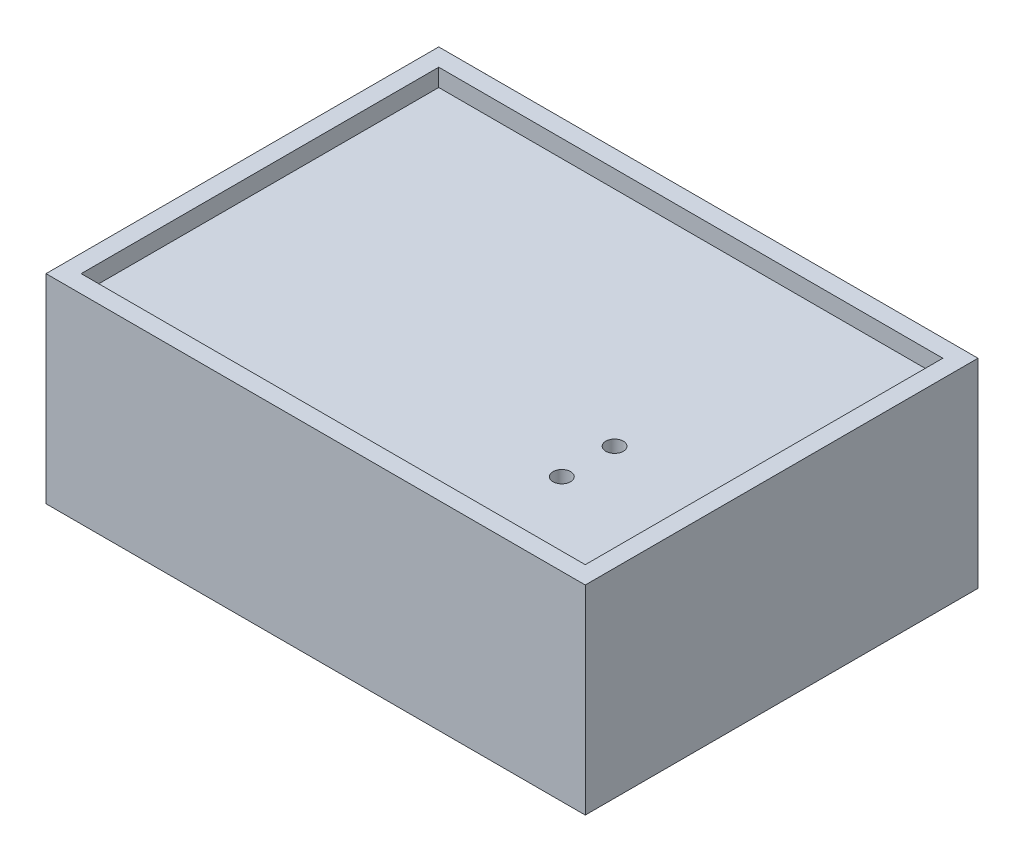
ISO-10303-21;
HEADER;
FILE_DESCRIPTION(('STEP AP214'),'2;1');
FILE_NAME('part.step','',(''),(''),'','','');
FILE_SCHEMA(('AUTOMOTIVE_DESIGN { 1 0 10303 214 1 1 1 1 }'));
ENDSEC;
DATA;
#1=APPLICATION_CONTEXT('core data for automotive mechanical design processes');
#2=APPLICATION_PROTOCOL_DEFINITION('international standard','automotive_design',2000,#1);
#3=PRODUCT_CONTEXT('',#1,'mechanical');
#4=PRODUCT('Part','Part','',(#3));
#5=PRODUCT_RELATED_PRODUCT_CATEGORY('part','',(#4));
#6=PRODUCT_DEFINITION_FORMATION('','',#4);
#7=PRODUCT_DEFINITION_CONTEXT('part definition',#1,'design');
#8=PRODUCT_DEFINITION('design','',#6,#7);
#9=PRODUCT_DEFINITION_SHAPE('','',#8);
#10=(LENGTH_UNIT() NAMED_UNIT(*) SI_UNIT(.MILLI.,.METRE.));
#11=(NAMED_UNIT(*) PLANE_ANGLE_UNIT() SI_UNIT($,.RADIAN.));
#12=(NAMED_UNIT(*) SI_UNIT($,.STERADIAN.) SOLID_ANGLE_UNIT());
#13=UNCERTAINTY_MEASURE_WITH_UNIT(LENGTH_MEASURE(1.E-05),#10,'distance_accuracy_value','');
#14=(GEOMETRIC_REPRESENTATION_CONTEXT(3) GLOBAL_UNCERTAINTY_ASSIGNED_CONTEXT((#13)) GLOBAL_UNIT_ASSIGNED_CONTEXT((#10,
#11,#12)) REPRESENTATION_CONTEXT('',''));
#15=CARTESIAN_POINT('',(0.,0.,0.));
#16=DIRECTION('',(0.,0.,1.));
#17=DIRECTION('',(1.,0.,0.));
#18=AXIS2_PLACEMENT_3D('',#15,#16,#17);
#19=CARTESIAN_POINT('',(46.,34.,33.5));
#20=DIRECTION('',(-1.,0.,0.));
#21=DIRECTION('',(0.,0.,1.));
#22=AXIS2_PLACEMENT_3D('',#19,#20,#21);
#23=PLANE('',#22);
#24=DIRECTION('',(0.,0.,-1.));
#25=VECTOR('',#24,1.);
#26=CARTESIAN_POINT('',(46.,0.,33.5));
#27=LINE('',#26,#25);
#28=CARTESIAN_POINT('',(46.,0.,33.5));
#29=VERTEX_POINT('',#28);
#30=CARTESIAN_POINT('',(46.,0.,-33.5));
#31=VERTEX_POINT('',#30);
#32=EDGE_CURVE('E207',#29,#31,#27,.T.);
#33=ORIENTED_EDGE('',*,*,#32,.T.);
#34=DIRECTION('',(0.,-1.,0.));
#35=VECTOR('',#34,1.);
#36=CARTESIAN_POINT('',(46.,34.,-33.5));
#37=LINE('',#36,#35);
#38=CARTESIAN_POINT('',(46.,34.,-33.5));
#39=VERTEX_POINT('',#38);
#40=EDGE_CURVE('E11',#39,#31,#37,.T.);
#41=ORIENTED_EDGE('',*,*,#40,.F.);
#42=DIRECTION('',(0.,0.,-1.));
#43=VECTOR('',#42,1.);
#44=CARTESIAN_POINT('',(46.,34.,33.5));
#45=LINE('',#44,#43);
#46=CARTESIAN_POINT('',(46.,34.,33.5));
#47=VERTEX_POINT('',#46);
#48=EDGE_CURVE('E213',#47,#39,#45,.T.);
#49=ORIENTED_EDGE('',*,*,#48,.F.);
#50=DIRECTION('',(0.,-1.,0.));
#51=VECTOR('',#50,1.);
#52=CARTESIAN_POINT('',(46.,34.,33.5));
#53=LINE('',#52,#51);
#54=EDGE_CURVE('E223',#47,#29,#53,.T.);
#55=ORIENTED_EDGE('',*,*,#54,.T.);
#56=EDGE_LOOP('',(#33,#41,#49,#55));
#57=FACE_BOUND('',#56,.T.);
#58=ADVANCED_FACE('F40',(#57),#23,.F.);
#59=CARTESIAN_POINT('',(-46.,34.,-33.5));
#60=DIRECTION('',(0.,0.,1.));
#61=DIRECTION('',(1.,0.,0.));
#62=AXIS2_PLACEMENT_3D('',#59,#60,#61);
#63=PLANE('',#62);
#64=DIRECTION('',(-1.,0.,0.));
#65=VECTOR('',#64,1.);
#66=CARTESIAN_POINT('',(-46.,0.,-33.5));
#67=LINE('',#66,#65);
#68=CARTESIAN_POINT('',(-46.,0.,-33.5));
#69=VERTEX_POINT('',#68);
#70=EDGE_CURVE('E226',#31,#69,#67,.T.);
#71=ORIENTED_EDGE('',*,*,#70,.T.);
#72=DIRECTION('',(0.,-1.,0.));
#73=VECTOR('',#72,1.);
#74=CARTESIAN_POINT('',(-46.,34.,-33.5));
#75=LINE('',#74,#73);
#76=CARTESIAN_POINT('',(-46.,34.,-33.5));
#77=VERTEX_POINT('',#76);
#78=EDGE_CURVE('E47',#77,#69,#75,.T.);
#79=ORIENTED_EDGE('',*,*,#78,.F.);
#80=DIRECTION('',(-1.,0.,0.));
#81=VECTOR('',#80,1.);
#82=CARTESIAN_POINT('',(-46.,34.,-33.5));
#83=LINE('',#82,#81);
#84=EDGE_CURVE('E216',#39,#77,#83,.T.);
#85=ORIENTED_EDGE('',*,*,#84,.F.);
#86=ORIENTED_EDGE('',*,*,#40,.T.);
#87=EDGE_LOOP('',(#71,#79,#85,#86));
#88=FACE_BOUND('',#87,.T.);
#89=ADVANCED_FACE('F256',(#88),#63,.F.);
#90=CARTESIAN_POINT('',(-46.,34.,33.5));
#91=DIRECTION('',(1.,0.,0.));
#92=DIRECTION('',(0.,0.,-1.));
#93=AXIS2_PLACEMENT_3D('',#90,#91,#92);
#94=PLANE('',#93);
#95=DIRECTION('',(0.,0.,1.));
#96=VECTOR('',#95,1.);
#97=CARTESIAN_POINT('',(-46.,0.,33.5));
#98=LINE('',#97,#96);
#99=CARTESIAN_POINT('',(-46.,0.,33.5));
#100=VERTEX_POINT('',#99);
#101=EDGE_CURVE('E228',#69,#100,#98,.T.);
#102=ORIENTED_EDGE('',*,*,#101,.T.);
#103=DIRECTION('',(0.,-1.,0.));
#104=VECTOR('',#103,1.);
#105=CARTESIAN_POINT('',(-46.,34.,33.5));
#106=LINE('',#105,#104);
#107=CARTESIAN_POINT('',(-46.,34.,33.5));
#108=VERTEX_POINT('',#107);
#109=EDGE_CURVE('E233',#108,#100,#106,.T.);
#110=ORIENTED_EDGE('',*,*,#109,.F.);
#111=DIRECTION('',(0.,0.,1.));
#112=VECTOR('',#111,1.);
#113=CARTESIAN_POINT('',(-46.,34.,33.5));
#114=LINE('',#113,#112);
#115=EDGE_CURVE('E219',#77,#108,#114,.T.);
#116=ORIENTED_EDGE('',*,*,#115,.F.);
#117=ORIENTED_EDGE('',*,*,#78,.T.);
#118=EDGE_LOOP('',(#102,#110,#116,#117));
#119=FACE_BOUND('',#118,.T.);
#120=ADVANCED_FACE('F240',(#119),#94,.F.);
#121=CARTESIAN_POINT('',(-46.,34.,33.5));
#122=DIRECTION('',(0.,0.,-1.));
#123=DIRECTION('',(-1.,0.,0.));
#124=AXIS2_PLACEMENT_3D('',#121,#122,#123);
#125=PLANE('',#124);
#126=DIRECTION('',(1.,0.,0.));
#127=VECTOR('',#126,1.);
#128=CARTESIAN_POINT('',(-46.,0.,33.5));
#129=LINE('',#128,#127);
#130=EDGE_CURVE('E217',#100,#29,#129,.T.);
#131=ORIENTED_EDGE('',*,*,#130,.T.);
#132=ORIENTED_EDGE('',*,*,#54,.F.);
#133=DIRECTION('',(1.,0.,0.));
#134=VECTOR('',#133,1.);
#135=CARTESIAN_POINT('',(-46.,34.,33.5));
#136=LINE('',#135,#134);
#137=EDGE_CURVE('E221',#108,#47,#136,.T.);
#138=ORIENTED_EDGE('',*,*,#137,.F.);
#139=ORIENTED_EDGE('',*,*,#109,.T.);
#140=EDGE_LOOP('',(#131,#132,#138,#139));
#141=FACE_BOUND('',#140,.T.);
#142=ADVANCED_FACE('F249',(#141),#125,.F.);
#143=CARTESIAN_POINT('',(0.,34.,0.));
#144=DIRECTION('',(0.,-1.,0.));
#145=DIRECTION('',(0.,0.,-1.));
#146=AXIS2_PLACEMENT_3D('',#143,#144,#145);
#147=PLANE('',#146);
#148=DIRECTION('',(0.,0.,-1.));
#149=VECTOR('',#148,1.);
#150=CARTESIAN_POINT('',(43.,34.,30.5));
#151=LINE('',#150,#149);
#152=CARTESIAN_POINT('',(43.,34.,30.5));
#153=VERTEX_POINT('',#152);
#154=CARTESIAN_POINT('',(43.,34.,-30.5));
#155=VERTEX_POINT('',#154);
#156=EDGE_CURVE('E197',#153,#155,#151,.T.);
#157=ORIENTED_EDGE('',*,*,#156,.F.);
#158=DIRECTION('',(1.,0.,0.));
#159=VECTOR('',#158,1.);
#160=CARTESIAN_POINT('',(-43.,34.,30.5));
#161=LINE('',#160,#159);
#162=CARTESIAN_POINT('',(-43.,34.,30.5));
#163=VERTEX_POINT('',#162);
#164=EDGE_CURVE('E62',#163,#153,#161,.T.);
#165=ORIENTED_EDGE('',*,*,#164,.F.);
#166=DIRECTION('',(0.,0.,1.));
#167=VECTOR('',#166,1.);
#168=CARTESIAN_POINT('',(-43.,34.,-30.5));
#169=LINE('',#168,#167);
#170=CARTESIAN_POINT('',(-43.,34.,-30.5));
#171=VERTEX_POINT('',#170);
#172=EDGE_CURVE('E186',#171,#163,#169,.T.);
#173=ORIENTED_EDGE('',*,*,#172,.F.);
#174=DIRECTION('',(-1.,0.,0.));
#175=VECTOR('',#174,1.);
#176=CARTESIAN_POINT('',(43.,34.,-30.5));
#177=LINE('',#176,#175);
#178=EDGE_CURVE('E200',#155,#171,#177,.T.);
#179=ORIENTED_EDGE('',*,*,#178,.F.);
#180=EDGE_LOOP('',(#157,#165,#173,#179));
#181=FACE_BOUND('',#180,.T.);
#182=ORIENTED_EDGE('',*,*,#48,.T.);
#183=ORIENTED_EDGE('',*,*,#84,.T.);
#184=ORIENTED_EDGE('',*,*,#115,.T.);
#185=ORIENTED_EDGE('',*,*,#137,.T.);
#186=EDGE_LOOP('',(#182,#183,#184,#185));
#187=FACE_BOUND('',#186,.T.);
#188=ADVANCED_FACE('F255',(#181,#187),#147,.F.);
#189=CARTESIAN_POINT('',(0.,0.,0.));
#190=DIRECTION('',(0.,-1.,0.));
#191=DIRECTION('',(0.,0.,-1.));
#192=AXIS2_PLACEMENT_3D('',#189,#190,#191);
#193=PLANE('',#192);
#194=DIRECTION('',(1.,0.,0.));
#195=VECTOR('',#194,1.);
#196=CARTESIAN_POINT('',(-43.,0.,-30.5));
#197=LINE('',#196,#195);
#198=CARTESIAN_POINT('',(-43.,0.,-30.5));
#199=VERTEX_POINT('',#198);
#200=CARTESIAN_POINT('',(43.,0.,-30.5));
#201=VERTEX_POINT('',#200);
#202=EDGE_CURVE('E54',#199,#201,#197,.T.);
#203=ORIENTED_EDGE('',*,*,#202,.F.);
#204=DIRECTION('',(0.,0.,-1.));
#205=VECTOR('',#204,1.);
#206=CARTESIAN_POINT('',(-43.,0.,30.5));
#207=LINE('',#206,#205);
#208=CARTESIAN_POINT('',(-43.,0.,30.5));
#209=VERTEX_POINT('',#208);
#210=EDGE_CURVE('E148',#209,#199,#207,.T.);
#211=ORIENTED_EDGE('',*,*,#210,.F.);
#212=DIRECTION('',(-1.,0.,0.));
#213=VECTOR('',#212,1.);
#214=CARTESIAN_POINT('',(43.,0.,30.5));
#215=LINE('',#214,#213);
#216=CARTESIAN_POINT('',(43.,0.,30.5));
#217=VERTEX_POINT('',#216);
#218=EDGE_CURVE('E151',#217,#209,#215,.T.);
#219=ORIENTED_EDGE('',*,*,#218,.F.);
#220=DIRECTION('',(0.,0.,1.));
#221=VECTOR('',#220,1.);
#222=CARTESIAN_POINT('',(43.,0.,-30.5));
#223=LINE('',#222,#221);
#224=EDGE_CURVE('E160',#201,#217,#223,.T.);
#225=ORIENTED_EDGE('',*,*,#224,.F.);
#226=EDGE_LOOP('',(#203,#211,#219,#225));
#227=FACE_BOUND('',#226,.T.);
#228=ORIENTED_EDGE('',*,*,#32,.F.);
#229=ORIENTED_EDGE('',*,*,#130,.F.);
#230=ORIENTED_EDGE('',*,*,#101,.F.);
#231=ORIENTED_EDGE('',*,*,#70,.F.);
#232=EDGE_LOOP('',(#228,#229,#230,#231));
#233=FACE_BOUND('',#232,.T.);
#234=ADVANCED_FACE('F246',(#227,#233),#193,.T.);
#235=CARTESIAN_POINT('',(-43.,31.,30.5));
#236=DIRECTION('',(0.,0.,1.));
#237=DIRECTION('',(1.,0.,0.));
#238=AXIS2_PLACEMENT_3D('',#235,#236,#237);
#239=PLANE('',#238);
#240=ORIENTED_EDGE('',*,*,#164,.T.);
#241=DIRECTION('',(0.,1.,0.));
#242=VECTOR('',#241,1.);
#243=CARTESIAN_POINT('',(43.,31.,30.5));
#244=LINE('',#243,#242);
#245=CARTESIAN_POINT('',(43.,31.,30.5));
#246=VERTEX_POINT('',#245);
#247=EDGE_CURVE('E195',#246,#153,#244,.T.);
#248=ORIENTED_EDGE('',*,*,#247,.F.);
#249=DIRECTION('',(1.,0.,0.));
#250=VECTOR('',#249,1.);
#251=CARTESIAN_POINT('',(-43.,31.,30.5));
#252=LINE('',#251,#250);
#253=CARTESIAN_POINT('',(-43.,31.,30.5));
#254=VERTEX_POINT('',#253);
#255=EDGE_CURVE('E182',#254,#246,#252,.T.);
#256=ORIENTED_EDGE('',*,*,#255,.F.);
#257=DIRECTION('',(0.,1.,0.));
#258=VECTOR('',#257,1.);
#259=CARTESIAN_POINT('',(-43.,31.,30.5));
#260=LINE('',#259,#258);
#261=EDGE_CURVE('E205',#254,#163,#260,.T.);
#262=ORIENTED_EDGE('',*,*,#261,.T.);
#263=EDGE_LOOP('',(#240,#248,#256,#262));
#264=FACE_BOUND('',#263,.T.);
#265=ADVANCED_FACE('F268',(#264),#239,.F.);
#266=CARTESIAN_POINT('',(-43.,31.,-30.5));
#267=DIRECTION('',(-1.,0.,0.));
#268=DIRECTION('',(0.,0.,1.));
#269=AXIS2_PLACEMENT_3D('',#266,#267,#268);
#270=PLANE('',#269);
#271=ORIENTED_EDGE('',*,*,#172,.T.);
#272=ORIENTED_EDGE('',*,*,#261,.F.);
#273=DIRECTION('',(0.,0.,1.));
#274=VECTOR('',#273,1.);
#275=CARTESIAN_POINT('',(-43.,31.,-30.5));
#276=LINE('',#275,#274);
#277=CARTESIAN_POINT('',(-43.,31.,-30.5));
#278=VERTEX_POINT('',#277);
#279=EDGE_CURVE('E192',#278,#254,#276,.T.);
#280=ORIENTED_EDGE('',*,*,#279,.F.);
#281=DIRECTION('',(0.,1.,0.));
#282=VECTOR('',#281,1.);
#283=CARTESIAN_POINT('',(-43.,31.,-30.5));
#284=LINE('',#283,#282);
#285=EDGE_CURVE('E208',#278,#171,#284,.T.);
#286=ORIENTED_EDGE('',*,*,#285,.T.);
#287=EDGE_LOOP('',(#271,#272,#280,#286));
#288=FACE_BOUND('',#287,.T.);
#289=ADVANCED_FACE('F275',(#288),#270,.F.);
#290=CARTESIAN_POINT('',(43.,31.,-30.5));
#291=DIRECTION('',(0.,0.,-1.));
#292=DIRECTION('',(-1.,0.,0.));
#293=AXIS2_PLACEMENT_3D('',#290,#291,#292);
#294=PLANE('',#293);
#295=ORIENTED_EDGE('',*,*,#178,.T.);
#296=ORIENTED_EDGE('',*,*,#285,.F.);
#297=DIRECTION('',(-1.,0.,0.));
#298=VECTOR('',#297,1.);
#299=CARTESIAN_POINT('',(43.,31.,-30.5));
#300=LINE('',#299,#298);
#301=CARTESIAN_POINT('',(43.,31.,-30.5));
#302=VERTEX_POINT('',#301);
#303=EDGE_CURVE('E189',#302,#278,#300,.T.);
#304=ORIENTED_EDGE('',*,*,#303,.F.);
#305=DIRECTION('',(0.,1.,0.));
#306=VECTOR('',#305,1.);
#307=CARTESIAN_POINT('',(43.,31.,-30.5));
#308=LINE('',#307,#306);
#309=EDGE_CURVE('E210',#302,#155,#308,.T.);
#310=ORIENTED_EDGE('',*,*,#309,.T.);
#311=EDGE_LOOP('',(#295,#296,#304,#310));
#312=FACE_BOUND('',#311,.T.);
#313=ADVANCED_FACE('F280',(#312),#294,.F.);
#314=CARTESIAN_POINT('',(43.,31.,30.5));
#315=DIRECTION('',(1.,0.,0.));
#316=DIRECTION('',(0.,0.,-1.));
#317=AXIS2_PLACEMENT_3D('',#314,#315,#316);
#318=PLANE('',#317);
#319=ORIENTED_EDGE('',*,*,#156,.T.);
#320=ORIENTED_EDGE('',*,*,#309,.F.);
#321=DIRECTION('',(0.,0.,-1.));
#322=VECTOR('',#321,1.);
#323=CARTESIAN_POINT('',(43.,31.,30.5));
#324=LINE('',#323,#322);
#325=EDGE_CURVE('E185',#246,#302,#324,.T.);
#326=ORIENTED_EDGE('',*,*,#325,.F.);
#327=ORIENTED_EDGE('',*,*,#247,.T.);
#328=EDGE_LOOP('',(#319,#320,#326,#327));
#329=FACE_BOUND('',#328,.T.);
#330=ADVANCED_FACE('F276',(#329),#318,.F.);
#331=CARTESIAN_POINT('',(0.,31.,0.));
#332=DIRECTION('',(0.,1.,0.));
#333=DIRECTION('',(0.,0.,1.));
#334=AXIS2_PLACEMENT_3D('',#331,#332,#333);
#335=PLANE('',#334);
#336=CARTESIAN_POINT('',(25.,31.,16.5));
#337=DIRECTION('',(0.,1.,0.));
#338=DIRECTION('',(0.,0.,1.));
#339=AXIS2_PLACEMENT_3D('',#336,#337,#338);
#340=CIRCLE('',#339,1.5);
#341=CARTESIAN_POINT('',(25.,31.,18.));
#342=VERTEX_POINT('',#341);
#343=EDGE_CURVE('E174',#342,#342,#340,.T.);
#344=ORIENTED_EDGE('',*,*,#343,.F.);
#345=EDGE_LOOP('',(#344));
#346=FACE_BOUND('',#345,.T.);
#347=CARTESIAN_POINT('',(25.,31.,7.5));
#348=DIRECTION('',(0.,1.,0.));
#349=DIRECTION('',(0.,0.,1.));
#350=AXIS2_PLACEMENT_3D('',#347,#348,#349);
#351=CIRCLE('',#350,1.5);
#352=CARTESIAN_POINT('',(25.,31.,9.));
#353=VERTEX_POINT('',#352);
#354=EDGE_CURVE('E167',#353,#353,#351,.T.);
#355=ORIENTED_EDGE('',*,*,#354,.F.);
#356=EDGE_LOOP('',(#355));
#357=FACE_BOUND('',#356,.T.);
#358=ORIENTED_EDGE('',*,*,#255,.T.);
#359=ORIENTED_EDGE('',*,*,#325,.T.);
#360=ORIENTED_EDGE('',*,*,#303,.T.);
#361=ORIENTED_EDGE('',*,*,#279,.T.);
#362=EDGE_LOOP('',(#358,#359,#360,#361));
#363=FACE_BOUND('',#362,.T.);
#364=ADVANCED_FACE('F279',(#346,#357,#363),#335,.T.);
#365=CARTESIAN_POINT('',(25.,28.,7.5));
#366=DIRECTION('',(0.,1.,0.));
#367=DIRECTION('',(0.,0.,1.));
#368=AXIS2_PLACEMENT_3D('',#365,#366,#367);
#369=CYLINDRICAL_SURFACE('',#368,1.5);
#370=CARTESIAN_POINT('',(25.,28.,7.5));
#371=DIRECTION('',(0.,1.,0.));
#372=DIRECTION('',(0.,0.,1.));
#373=AXIS2_PLACEMENT_3D('',#370,#371,#372);
#374=CIRCLE('',#373,1.5);
#375=CARTESIAN_POINT('',(25.,28.,9.));
#376=VERTEX_POINT('',#375);
#377=EDGE_CURVE('E177',#376,#376,#374,.T.);
#378=ORIENTED_EDGE('',*,*,#377,.F.);
#379=EDGE_LOOP('',(#378));
#380=FACE_BOUND('',#379,.T.);
#381=ORIENTED_EDGE('',*,*,#354,.T.);
#382=EDGE_LOOP('',(#381));
#383=FACE_BOUND('',#382,.T.);
#384=ADVANCED_FACE('F290',(#380,#383),#369,.F.);
#385=CARTESIAN_POINT('',(25.,28.,7.5));
#386=DIRECTION('',(0.,1.,0.));
#387=DIRECTION('',(0.,0.,1.));
#388=AXIS2_PLACEMENT_3D('',#385,#386,#387);
#389=PLANE('',#388);
#390=ORIENTED_EDGE('',*,*,#377,.T.);
#391=EDGE_LOOP('',(#390));
#392=FACE_BOUND('',#391,.T.);
#393=ADVANCED_FACE('F294',(#392),#389,.T.);
#394=CARTESIAN_POINT('',(25.,28.,16.5));
#395=DIRECTION('',(0.,1.,0.));
#396=DIRECTION('',(0.,0.,1.));
#397=AXIS2_PLACEMENT_3D('',#394,#395,#396);
#398=CYLINDRICAL_SURFACE('',#397,1.5);
#399=CARTESIAN_POINT('',(25.,28.,16.5));
#400=DIRECTION('',(0.,1.,0.));
#401=DIRECTION('',(0.,0.,1.));
#402=AXIS2_PLACEMENT_3D('',#399,#400,#401);
#403=CIRCLE('',#402,1.5);
#404=CARTESIAN_POINT('',(25.,28.,18.));
#405=VERTEX_POINT('',#404);
#406=EDGE_CURVE('E171',#405,#405,#403,.T.);
#407=ORIENTED_EDGE('',*,*,#406,.F.);
#408=EDGE_LOOP('',(#407));
#409=FACE_BOUND('',#408,.T.);
#410=ORIENTED_EDGE('',*,*,#343,.T.);
#411=EDGE_LOOP('',(#410));
#412=FACE_BOUND('',#411,.T.);
#413=ADVANCED_FACE('F298',(#409,#412),#398,.F.);
#414=CARTESIAN_POINT('',(25.,28.,16.5));
#415=DIRECTION('',(0.,1.,0.));
#416=DIRECTION('',(0.,0.,1.));
#417=AXIS2_PLACEMENT_3D('',#414,#415,#416);
#418=PLANE('',#417);
#419=ORIENTED_EDGE('',*,*,#406,.T.);
#420=EDGE_LOOP('',(#419));
#421=FACE_BOUND('',#420,.T.);
#422=ADVANCED_FACE('F302',(#421),#418,.T.);
#423=CARTESIAN_POINT('',(-43.,3.,-30.5));
#424=DIRECTION('',(0.,0.,-1.));
#425=DIRECTION('',(-1.,0.,0.));
#426=AXIS2_PLACEMENT_3D('',#423,#424,#425);
#427=PLANE('',#426);
#428=ORIENTED_EDGE('',*,*,#202,.T.);
#429=DIRECTION('',(0.,-1.,0.));
#430=VECTOR('',#429,1.);
#431=CARTESIAN_POINT('',(43.,3.,-30.5));
#432=LINE('',#431,#430);
#433=CARTESIAN_POINT('',(43.,3.,-30.5));
#434=VERTEX_POINT('',#433);
#435=EDGE_CURVE('E126',#434,#201,#432,.T.);
#436=ORIENTED_EDGE('',*,*,#435,.F.);
#437=DIRECTION('',(1.,0.,0.));
#438=VECTOR('',#437,1.);
#439=CARTESIAN_POINT('',(-43.,3.,-30.5));
#440=LINE('',#439,#438);
#441=CARTESIAN_POINT('',(-43.,3.,-30.5));
#442=VERTEX_POINT('',#441);
#443=EDGE_CURVE('E130',#442,#434,#440,.T.);
#444=ORIENTED_EDGE('',*,*,#443,.F.);
#445=DIRECTION('',(0.,-1.,0.));
#446=VECTOR('',#445,1.);
#447=CARTESIAN_POINT('',(-43.,3.,-30.5));
#448=LINE('',#447,#446);
#449=EDGE_CURVE('E165',#442,#199,#448,.T.);
#450=ORIENTED_EDGE('',*,*,#449,.T.);
#451=EDGE_LOOP('',(#428,#436,#444,#450));
#452=FACE_BOUND('',#451,.T.);
#453=ADVANCED_FACE('F128',(#452),#427,.F.);
#454=CARTESIAN_POINT('',(-43.,3.,30.5));
#455=DIRECTION('',(-1.,0.,0.));
#456=DIRECTION('',(0.,0.,1.));
#457=AXIS2_PLACEMENT_3D('',#454,#455,#456);
#458=PLANE('',#457);
#459=ORIENTED_EDGE('',*,*,#210,.T.);
#460=ORIENTED_EDGE('',*,*,#449,.F.);
#461=DIRECTION('',(0.,0.,-1.));
#462=VECTOR('',#461,1.);
#463=CARTESIAN_POINT('',(-43.,3.,30.5));
#464=LINE('',#463,#462);
#465=CARTESIAN_POINT('',(-43.,3.,30.5));
#466=VERTEX_POINT('',#465);
#467=EDGE_CURVE('E136',#466,#442,#464,.T.);
#468=ORIENTED_EDGE('',*,*,#467,.F.);
#469=DIRECTION('',(0.,-1.,0.));
#470=VECTOR('',#469,1.);
#471=CARTESIAN_POINT('',(-43.,3.,30.5));
#472=LINE('',#471,#470);
#473=EDGE_CURVE('E168',#466,#209,#472,.T.);
#474=ORIENTED_EDGE('',*,*,#473,.T.);
#475=EDGE_LOOP('',(#459,#460,#468,#474));
#476=FACE_BOUND('',#475,.T.);
#477=ADVANCED_FACE('F309',(#476),#458,.F.);
#478=CARTESIAN_POINT('',(43.,3.,30.5));
#479=DIRECTION('',(0.,0.,1.));
#480=DIRECTION('',(1.,0.,0.));
#481=AXIS2_PLACEMENT_3D('',#478,#479,#480);
#482=PLANE('',#481);
#483=ORIENTED_EDGE('',*,*,#218,.T.);
#484=ORIENTED_EDGE('',*,*,#473,.F.);
#485=DIRECTION('',(-1.,0.,0.));
#486=VECTOR('',#485,1.);
#487=CARTESIAN_POINT('',(43.,3.,30.5));
#488=LINE('',#487,#486);
#489=CARTESIAN_POINT('',(43.,3.,30.5));
#490=VERTEX_POINT('',#489);
#491=EDGE_CURVE('E144',#490,#466,#488,.T.);
#492=ORIENTED_EDGE('',*,*,#491,.F.);
#493=DIRECTION('',(0.,-1.,0.));
#494=VECTOR('',#493,1.);
#495=CARTESIAN_POINT('',(43.,3.,30.5));
#496=LINE('',#495,#494);
#497=EDGE_CURVE('E135',#490,#217,#496,.T.);
#498=ORIENTED_EDGE('',*,*,#497,.T.);
#499=EDGE_LOOP('',(#483,#484,#492,#498));
#500=FACE_BOUND('',#499,.T.);
#501=ADVANCED_FACE('F312',(#500),#482,.F.);
#502=CARTESIAN_POINT('',(43.,3.,-30.5));
#503=DIRECTION('',(1.,0.,0.));
#504=DIRECTION('',(0.,0.,-1.));
#505=AXIS2_PLACEMENT_3D('',#502,#503,#504);
#506=PLANE('',#505);
#507=ORIENTED_EDGE('',*,*,#224,.T.);
#508=ORIENTED_EDGE('',*,*,#497,.F.);
#509=DIRECTION('',(0.,0.,1.));
#510=VECTOR('',#509,1.);
#511=CARTESIAN_POINT('',(43.,3.,-30.5));
#512=LINE('',#511,#510);
#513=EDGE_CURVE('E139',#434,#490,#512,.T.);
#514=ORIENTED_EDGE('',*,*,#513,.F.);
#515=ORIENTED_EDGE('',*,*,#435,.T.);
#516=EDGE_LOOP('',(#507,#508,#514,#515));
#517=FACE_BOUND('',#516,.T.);
#518=ADVANCED_FACE('F140',(#517),#506,.F.);
#519=CARTESIAN_POINT('',(0.,3.,0.));
#520=DIRECTION('',(0.,-1.,0.));
#521=DIRECTION('',(0.,0.,-1.));
#522=AXIS2_PLACEMENT_3D('',#519,#520,#521);
#523=PLANE('',#522);
#524=CARTESIAN_POINT('',(-39.,3.,-24.5));
#525=DIRECTION('',(0.,-1.,0.));
#526=DIRECTION('',(0.,0.,1.));
#527=AXIS2_PLACEMENT_3D('',#524,#525,#526);
#528=CIRCLE('',#527,1.5);
#529=CARTESIAN_POINT('',(-39.,3.,-23.));
#530=VERTEX_POINT('',#529);
#531=EDGE_CURVE('E373',#530,#530,#528,.T.);
#532=ORIENTED_EDGE('',*,*,#531,.F.);
#533=EDGE_LOOP('',(#532));
#534=FACE_BOUND('',#533,.T.);
#535=CARTESIAN_POINT('',(19.,3.,-24.5));
#536=DIRECTION('',(0.,-1.,0.));
#537=DIRECTION('',(0.,0.,-1.));
#538=AXIS2_PLACEMENT_3D('',#535,#536,#537);
#539=CIRCLE('',#538,1.5);
#540=CARTESIAN_POINT('',(19.,3.,-26.));
#541=VERTEX_POINT('',#540);
#542=EDGE_CURVE('E367',#541,#541,#539,.T.);
#543=ORIENTED_EDGE('',*,*,#542,.F.);
#544=EDGE_LOOP('',(#543));
#545=FACE_BOUND('',#544,.T.);
#546=CARTESIAN_POINT('',(19.,3.,24.5));
#547=DIRECTION('',(0.,-1.,0.));
#548=DIRECTION('',(0.,0.,1.));
#549=AXIS2_PLACEMENT_3D('',#546,#547,#548);
#550=CIRCLE('',#549,1.5);
#551=CARTESIAN_POINT('',(19.,3.,26.));
#552=VERTEX_POINT('',#551);
#553=EDGE_CURVE('E358',#552,#552,#550,.T.);
#554=ORIENTED_EDGE('',*,*,#553,.F.);
#555=EDGE_LOOP('',(#554));
#556=FACE_BOUND('',#555,.T.);
#557=CARTESIAN_POINT('',(-39.,3.,24.5));
#558=DIRECTION('',(0.,-1.,0.));
#559=DIRECTION('',(0.,0.,-1.));
#560=AXIS2_PLACEMENT_3D('',#557,#558,#559);
#561=CIRCLE('',#560,1.5);
#562=CARTESIAN_POINT('',(-39.,3.,23.));
#563=VERTEX_POINT('',#562);
#564=EDGE_CURVE('E154',#563,#563,#561,.T.);
#565=ORIENTED_EDGE('',*,*,#564,.F.);
#566=EDGE_LOOP('',(#565));
#567=FACE_BOUND('',#566,.T.);
#568=ORIENTED_EDGE('',*,*,#443,.T.);
#569=ORIENTED_EDGE('',*,*,#513,.T.);
#570=ORIENTED_EDGE('',*,*,#491,.T.);
#571=ORIENTED_EDGE('',*,*,#467,.T.);
#572=EDGE_LOOP('',(#568,#569,#570,#571));
#573=FACE_BOUND('',#572,.T.);
#574=ADVANCED_FACE('F146',(#534,#545,#556,#567,#573),#523,.T.);
#575=CARTESIAN_POINT('',(-39.,6.,24.5));
#576=DIRECTION('',(0.,-1.,0.));
#577=DIRECTION('',(0.,0.,-1.));
#578=AXIS2_PLACEMENT_3D('',#575,#576,#577);
#579=CYLINDRICAL_SURFACE('',#578,1.5);
#580=CARTESIAN_POINT('',(-39.,6.,24.5));
#581=DIRECTION('',(0.,-1.,0.));
#582=DIRECTION('',(0.,0.,-1.));
#583=AXIS2_PLACEMENT_3D('',#580,#581,#582);
#584=CIRCLE('',#583,1.5);
#585=CARTESIAN_POINT('',(-39.,6.,23.));
#586=VERTEX_POINT('',#585);
#587=EDGE_CURVE('E161',#586,#586,#584,.T.);
#588=ORIENTED_EDGE('',*,*,#587,.F.);
#589=EDGE_LOOP('',(#588));
#590=FACE_BOUND('',#589,.T.);
#591=ORIENTED_EDGE('',*,*,#564,.T.);
#592=EDGE_LOOP('',(#591));
#593=FACE_BOUND('',#592,.T.);
#594=ADVANCED_FACE('F321',(#590,#593),#579,.F.);
#595=CARTESIAN_POINT('',(-39.,6.,24.5));
#596=DIRECTION('',(0.,-1.,0.));
#597=DIRECTION('',(0.,0.,-1.));
#598=AXIS2_PLACEMENT_3D('',#595,#596,#597);
#599=PLANE('',#598);
#600=ORIENTED_EDGE('',*,*,#587,.T.);
#601=EDGE_LOOP('',(#600));
#602=FACE_BOUND('',#601,.T.);
#603=ADVANCED_FACE('F325',(#602),#599,.T.);
#604=CARTESIAN_POINT('',(19.,6.,24.5));
#605=DIRECTION('',(0.,-1.,0.));
#606=DIRECTION('',(0.,0.,-1.));
#607=AXIS2_PLACEMENT_3D('',#604,#605,#606);
#608=CYLINDRICAL_SURFACE('',#607,1.5);
#609=CARTESIAN_POINT('',(19.,6.,24.5));
#610=DIRECTION('',(0.,-1.,0.));
#611=DIRECTION('',(0.,0.,1.));
#612=AXIS2_PLACEMENT_3D('',#609,#610,#611);
#613=CIRCLE('',#612,1.5);
#614=CARTESIAN_POINT('',(19.,6.,26.));
#615=VERTEX_POINT('',#614);
#616=EDGE_CURVE('E357',#615,#615,#613,.T.);
#617=ORIENTED_EDGE('',*,*,#616,.F.);
#618=EDGE_LOOP('',(#617));
#619=FACE_BOUND('',#618,.T.);
#620=ORIENTED_EDGE('',*,*,#553,.T.);
#621=EDGE_LOOP('',(#620));
#622=FACE_BOUND('',#621,.T.);
#623=ADVANCED_FACE('F329',(#619,#622),#608,.F.);
#624=CARTESIAN_POINT('',(19.,6.,24.5));
#625=DIRECTION('',(0.,1.,0.));
#626=DIRECTION('',(0.,0.,1.));
#627=AXIS2_PLACEMENT_3D('',#624,#625,#626);
#628=PLANE('',#627);
#629=ORIENTED_EDGE('',*,*,#616,.T.);
#630=EDGE_LOOP('',(#629));
#631=FACE_BOUND('',#630,.T.);
#632=ADVANCED_FACE('F343',(#631),#628,.F.);
#633=CARTESIAN_POINT('',(19.,6.,-24.5));
#634=DIRECTION('',(0.,-1.,0.));
#635=DIRECTION('',(0.,0.,-1.));
#636=AXIS2_PLACEMENT_3D('',#633,#634,#635);
#637=CYLINDRICAL_SURFACE('',#636,1.5);
#638=CARTESIAN_POINT('',(19.,6.,-24.5));
#639=DIRECTION('',(0.,-1.,0.));
#640=DIRECTION('',(0.,0.,-1.));
#641=AXIS2_PLACEMENT_3D('',#638,#639,#640);
#642=CIRCLE('',#641,1.5);
#643=CARTESIAN_POINT('',(19.,6.,-26.));
#644=VERTEX_POINT('',#643);
#645=EDGE_CURVE('E362',#644,#644,#642,.T.);
#646=ORIENTED_EDGE('',*,*,#645,.F.);
#647=EDGE_LOOP('',(#646));
#648=FACE_BOUND('',#647,.T.);
#649=ORIENTED_EDGE('',*,*,#542,.T.);
#650=EDGE_LOOP('',(#649));
#651=FACE_BOUND('',#650,.T.);
#652=ADVANCED_FACE('F340',(#648,#651),#637,.F.);
#653=CARTESIAN_POINT('',(19.,6.,-24.5));
#654=DIRECTION('',(0.,-1.,0.));
#655=DIRECTION('',(0.,0.,-1.));
#656=AXIS2_PLACEMENT_3D('',#653,#654,#655);
#657=PLANE('',#656);
#658=ORIENTED_EDGE('',*,*,#645,.T.);
#659=EDGE_LOOP('',(#658));
#660=FACE_BOUND('',#659,.T.);
#661=ADVANCED_FACE('F335',(#660),#657,.T.);
#662=CARTESIAN_POINT('',(-39.,6.,-24.5));
#663=DIRECTION('',(0.,-1.,0.));
#664=DIRECTION('',(0.,0.,-1.));
#665=AXIS2_PLACEMENT_3D('',#662,#663,#664);
#666=CYLINDRICAL_SURFACE('',#665,1.5);
#667=CARTESIAN_POINT('',(-39.,6.,-24.5));
#668=DIRECTION('',(0.,-1.,0.));
#669=DIRECTION('',(0.,0.,1.));
#670=AXIS2_PLACEMENT_3D('',#667,#668,#669);
#671=CIRCLE('',#670,1.5);
#672=CARTESIAN_POINT('',(-39.,6.,-23.));
#673=VERTEX_POINT('',#672);
#674=EDGE_CURVE('E370',#673,#673,#671,.T.);
#675=ORIENTED_EDGE('',*,*,#674,.F.);
#676=EDGE_LOOP('',(#675));
#677=FACE_BOUND('',#676,.T.);
#678=ORIENTED_EDGE('',*,*,#531,.T.);
#679=EDGE_LOOP('',(#678));
#680=FACE_BOUND('',#679,.T.);
#681=ADVANCED_FACE('F331',(#677,#680),#666,.F.);
#682=CARTESIAN_POINT('',(-39.,6.,-24.5));
#683=DIRECTION('',(0.,1.,0.));
#684=DIRECTION('',(0.,0.,1.));
#685=AXIS2_PLACEMENT_3D('',#682,#683,#684);
#686=PLANE('',#685);
#687=ORIENTED_EDGE('',*,*,#674,.T.);
#688=EDGE_LOOP('',(#687));
#689=FACE_BOUND('',#688,.T.);
#690=ADVANCED_FACE('F334',(#689),#686,.F.);
#691=CLOSED_SHELL('',(#58,#89,#120,#142,#188,#234,#265,#289,#313,#330,#364,#384,#393,#413,#422,
#453,#477,#501,#518,#574,#594,#603,#623,#632,#652,#661,#681,#690));
#692=MANIFOLD_SOLID_BREP('B2',#691);
#693=ADVANCED_BREP_SHAPE_REPRESENTATION('',(#18,#692),#14);
#694=SHAPE_DEFINITION_REPRESENTATION(#9,#693);
ENDSEC;
END-ISO-10303-21;
